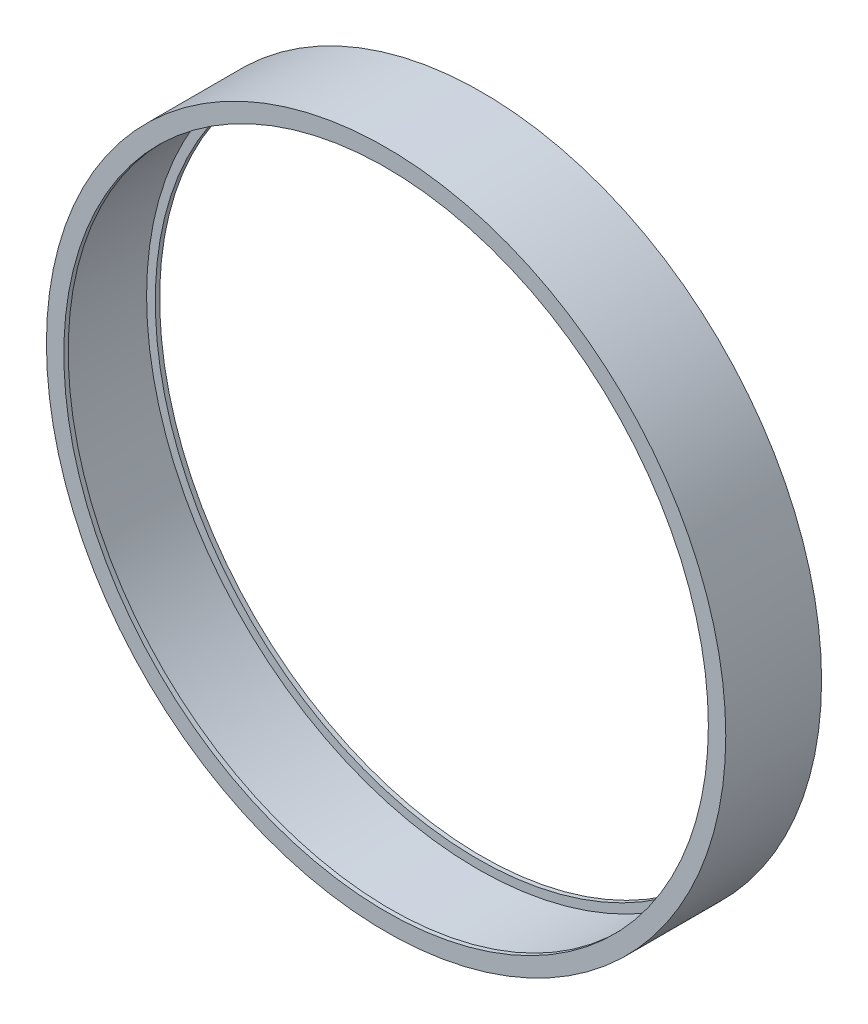
ISO-10303-21;
HEADER;
FILE_DESCRIPTION(('STEP AP214'),'2;1');
FILE_NAME('part.step','',(''),(''),'','','');
FILE_SCHEMA(('AUTOMOTIVE_DESIGN { 1 0 10303 214 1 1 1 1 }'));
ENDSEC;
DATA;
#1=APPLICATION_CONTEXT('core data for automotive mechanical design processes');
#2=APPLICATION_PROTOCOL_DEFINITION('international standard','automotive_design',2000,#1);
#3=PRODUCT_CONTEXT('',#1,'mechanical');
#4=PRODUCT('Part','Part','',(#3));
#5=PRODUCT_RELATED_PRODUCT_CATEGORY('part','',(#4));
#6=PRODUCT_DEFINITION_FORMATION('','',#4);
#7=PRODUCT_DEFINITION_CONTEXT('part definition',#1,'design');
#8=PRODUCT_DEFINITION('design','',#6,#7);
#9=PRODUCT_DEFINITION_SHAPE('','',#8);
#10=(LENGTH_UNIT() NAMED_UNIT(*) SI_UNIT(.MILLI.,.METRE.));
#11=(NAMED_UNIT(*) PLANE_ANGLE_UNIT() SI_UNIT($,.RADIAN.));
#12=(NAMED_UNIT(*) SI_UNIT($,.STERADIAN.) SOLID_ANGLE_UNIT());
#13=UNCERTAINTY_MEASURE_WITH_UNIT(LENGTH_MEASURE(1.E-05),#10,'distance_accuracy_value','');
#14=(GEOMETRIC_REPRESENTATION_CONTEXT(3) GLOBAL_UNCERTAINTY_ASSIGNED_CONTEXT((#13)) GLOBAL_UNIT_ASSIGNED_CONTEXT((#10,
#11,#12)) REPRESENTATION_CONTEXT('',''));
#15=CARTESIAN_POINT('',(0.,0.,0.));
#16=DIRECTION('',(0.,0.,1.));
#17=DIRECTION('',(1.,0.,0.));
#18=AXIS2_PLACEMENT_3D('',#15,#16,#17);
#19=CARTESIAN_POINT('',(0.,0.,5.5));
#20=DIRECTION('',(0.,0.,-1.));
#21=DIRECTION('',(-1.,0.,0.));
#22=AXIS2_PLACEMENT_3D('',#19,#20,#21);
#23=CYLINDRICAL_SURFACE('',#22,37.);
#24=CARTESIAN_POINT('',(0.,0.,-5.5));
#25=DIRECTION('',(0.,0.,1.));
#26=DIRECTION('',(1.,0.,0.));
#27=AXIS2_PLACEMENT_3D('',#24,#25,#26);
#28=CIRCLE('',#27,37.);
#29=CARTESIAN_POINT('',(37.,0.,-5.5));
#30=VERTEX_POINT('',#29);
#31=EDGE_CURVE('E66',#30,#30,#28,.T.);
#32=ORIENTED_EDGE('',*,*,#31,.F.);
#33=EDGE_LOOP('',(#32));
#34=FACE_BOUND('',#33,.T.);
#35=CARTESIAN_POINT('',(0.,0.,-5.));
#36=DIRECTION('',(0.,0.,1.));
#37=DIRECTION('',(1.,0.,0.));
#38=AXIS2_PLACEMENT_3D('',#35,#36,#37);
#39=CIRCLE('',#38,37.);
#40=CARTESIAN_POINT('',(37.,0.,-5.));
#41=VERTEX_POINT('',#40);
#42=EDGE_CURVE('E78',#41,#41,#39,.T.);
#43=ORIENTED_EDGE('',*,*,#42,.T.);
#44=EDGE_LOOP('',(#43));
#45=FACE_BOUND('',#44,.T.);
#46=ADVANCED_FACE('F51',(#34,#45),#23,.F.);
#47=CARTESIAN_POINT('',(0.,0.,5.5));
#48=DIRECTION('',(0.,0.,1.));
#49=DIRECTION('',(1.,0.,0.));
#50=AXIS2_PLACEMENT_3D('',#47,#48,#49);
#51=PLANE('',#50);
#52=CARTESIAN_POINT('',(0.,0.,5.5));
#53=DIRECTION('',(0.,0.,1.));
#54=DIRECTION('',(1.,0.,0.));
#55=AXIS2_PLACEMENT_3D('',#52,#53,#54);
#56=CIRCLE('',#55,39.);
#57=CARTESIAN_POINT('',(39.,0.,5.5));
#58=VERTEX_POINT('',#57);
#59=EDGE_CURVE('E11',#58,#58,#56,.T.);
#60=ORIENTED_EDGE('',*,*,#59,.T.);
#61=EDGE_LOOP('',(#60));
#62=FACE_BOUND('',#61,.T.);
#63=CARTESIAN_POINT('',(0.,0.,5.5));
#64=DIRECTION('',(0.,0.,1.));
#65=DIRECTION('',(1.,0.,0.));
#66=AXIS2_PLACEMENT_3D('',#63,#64,#65);
#67=CIRCLE('',#66,37.);
#68=CARTESIAN_POINT('',(37.,0.,5.5));
#69=VERTEX_POINT('',#68);
#70=EDGE_CURVE('E64',#69,#69,#67,.T.);
#71=ORIENTED_EDGE('',*,*,#70,.F.);
#72=EDGE_LOOP('',(#71));
#73=FACE_BOUND('',#72,.T.);
#74=ADVANCED_FACE('F111',(#62,#73),#51,.T.);
#75=CARTESIAN_POINT('',(0.,0.,-5.5));
#76=DIRECTION('',(0.,0.,1.));
#77=DIRECTION('',(1.,0.,0.));
#78=AXIS2_PLACEMENT_3D('',#75,#76,#77);
#79=PLANE('',#78);
#80=CARTESIAN_POINT('',(0.,0.,-5.5));
#81=DIRECTION('',(0.,0.,1.));
#82=DIRECTION('',(1.,0.,0.));
#83=AXIS2_PLACEMENT_3D('',#80,#81,#82);
#84=CIRCLE('',#83,39.);
#85=CARTESIAN_POINT('',(39.,0.,-5.5));
#86=VERTEX_POINT('',#85);
#87=EDGE_CURVE('E55',#86,#86,#84,.T.);
#88=ORIENTED_EDGE('',*,*,#87,.F.);
#89=EDGE_LOOP('',(#88));
#90=FACE_BOUND('',#89,.T.);
#91=ORIENTED_EDGE('',*,*,#31,.T.);
#92=EDGE_LOOP('',(#91));
#93=FACE_BOUND('',#92,.T.);
#94=ADVANCED_FACE('F117',(#90,#93),#79,.F.);
#95=CARTESIAN_POINT('',(0.,0.,5.5));
#96=DIRECTION('',(0.,0.,-1.));
#97=DIRECTION('',(-1.,0.,0.));
#98=AXIS2_PLACEMENT_3D('',#95,#96,#97);
#99=CYLINDRICAL_SURFACE('',#98,39.);
#100=ORIENTED_EDGE('',*,*,#59,.F.);
#101=EDGE_LOOP('',(#100));
#102=FACE_BOUND('',#101,.T.);
#103=ORIENTED_EDGE('',*,*,#87,.T.);
#104=EDGE_LOOP('',(#103));
#105=FACE_BOUND('',#104,.T.);
#106=ADVANCED_FACE('F53',(#102,#105),#99,.T.);
#107=CARTESIAN_POINT('',(0.,0.,5.));
#108=DIRECTION('',(0.,0.,1.));
#109=DIRECTION('',(1.,0.,0.));
#110=AXIS2_PLACEMENT_3D('',#107,#108,#109);
#111=CIRCLE('',#110,37.);
#112=CARTESIAN_POINT('',(37.,0.,5.));
#113=VERTEX_POINT('',#112);
#114=EDGE_CURVE('E82',#113,#113,#111,.T.);
#115=ORIENTED_EDGE('',*,*,#114,.F.);
#116=EDGE_LOOP('',(#115));
#117=FACE_BOUND('',#116,.T.);
#118=ORIENTED_EDGE('',*,*,#70,.T.);
#119=EDGE_LOOP('',(#118));
#120=FACE_BOUND('',#119,.T.);
#121=ADVANCED_FACE('F101',(#117,#120),#23,.F.);
#122=CARTESIAN_POINT('',(0.,0.,-5.));
#123=DIRECTION('',(0.,0.,1.));
#124=DIRECTION('',(1.,0.,0.));
#125=AXIS2_PLACEMENT_3D('',#122,#123,#124);
#126=CYLINDRICAL_SURFACE('',#125,38.);
#127=CARTESIAN_POINT('',(0.,0.,-5.));
#128=DIRECTION('',(0.,0.,1.));
#129=DIRECTION('',(1.,0.,0.));
#130=AXIS2_PLACEMENT_3D('',#127,#128,#129);
#131=CIRCLE('',#130,38.);
#132=CARTESIAN_POINT('',(38.,0.,-5.));
#133=VERTEX_POINT('',#132);
#134=EDGE_CURVE('E70',#133,#133,#131,.T.);
#135=ORIENTED_EDGE('',*,*,#134,.F.);
#136=EDGE_LOOP('',(#135));
#137=FACE_BOUND('',#136,.T.);
#138=CARTESIAN_POINT('',(0.,0.,5.));
#139=DIRECTION('',(0.,0.,1.));
#140=DIRECTION('',(1.,0.,0.));
#141=AXIS2_PLACEMENT_3D('',#138,#139,#140);
#142=CIRCLE('',#141,38.);
#143=CARTESIAN_POINT('',(38.,0.,5.));
#144=VERTEX_POINT('',#143);
#145=EDGE_CURVE('E74',#144,#144,#142,.T.);
#146=ORIENTED_EDGE('',*,*,#145,.T.);
#147=EDGE_LOOP('',(#146));
#148=FACE_BOUND('',#147,.T.);
#149=ADVANCED_FACE('F95',(#137,#148),#126,.F.);
#150=CARTESIAN_POINT('',(0.,0.,-5.));
#151=DIRECTION('',(0.,0.,1.));
#152=DIRECTION('',(1.,0.,0.));
#153=AXIS2_PLACEMENT_3D('',#150,#151,#152);
#154=PLANE('',#153);
#155=ORIENTED_EDGE('',*,*,#42,.F.);
#156=EDGE_LOOP('',(#155));
#157=FACE_BOUND('',#156,.T.);
#158=ORIENTED_EDGE('',*,*,#134,.T.);
#159=EDGE_LOOP('',(#158));
#160=FACE_BOUND('',#159,.T.);
#161=ADVANCED_FACE('F91',(#157,#160),#154,.T.);
#162=CARTESIAN_POINT('',(0.,0.,5.));
#163=DIRECTION('',(0.,0.,1.));
#164=DIRECTION('',(1.,0.,0.));
#165=AXIS2_PLACEMENT_3D('',#162,#163,#164);
#166=PLANE('',#165);
#167=ORIENTED_EDGE('',*,*,#114,.T.);
#168=EDGE_LOOP('',(#167));
#169=FACE_BOUND('',#168,.T.);
#170=ORIENTED_EDGE('',*,*,#145,.F.);
#171=EDGE_LOOP('',(#170));
#172=FACE_BOUND('',#171,.T.);
#173=ADVANCED_FACE('F94',(#169,#172),#166,.F.);
#174=CLOSED_SHELL('',(#46,#74,#94,#106,#121,#149,#161,#173));
#175=MANIFOLD_SOLID_BREP('B2',#174);
#176=ADVANCED_BREP_SHAPE_REPRESENTATION('',(#18,#175),#14);
#177=SHAPE_DEFINITION_REPRESENTATION(#9,#176);
ENDSEC;
END-ISO-10303-21;
